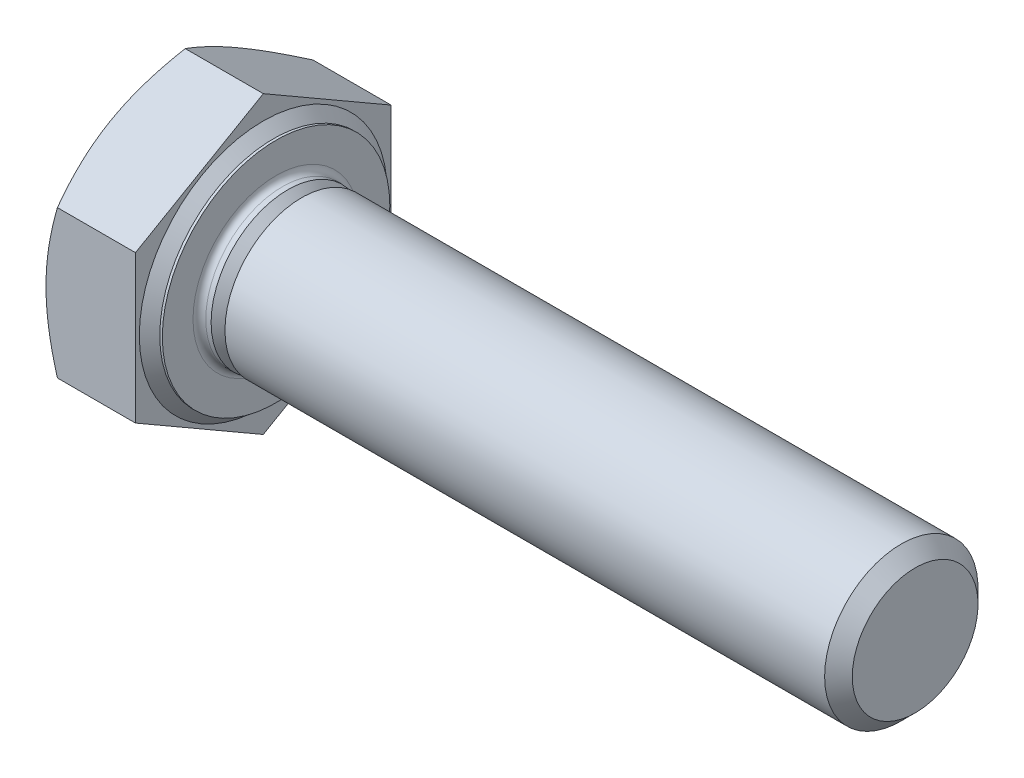
ISO-10303-21;
HEADER;
FILE_DESCRIPTION(('STEP AP214'),'2;1');
FILE_NAME('part.step','',(''),(''),'','','');
FILE_SCHEMA(('AUTOMOTIVE_DESIGN { 1 0 10303 214 1 1 1 1 }'));
ENDSEC;
DATA;
#1=APPLICATION_CONTEXT('core data for automotive mechanical design processes');
#2=APPLICATION_PROTOCOL_DEFINITION('international standard','automotive_design',2000,#1);
#3=PRODUCT_CONTEXT('',#1,'mechanical');
#4=PRODUCT('Part','Part','',(#3));
#5=PRODUCT_RELATED_PRODUCT_CATEGORY('part','',(#4));
#6=PRODUCT_DEFINITION_FORMATION('','',#4);
#7=PRODUCT_DEFINITION_CONTEXT('part definition',#1,'design');
#8=PRODUCT_DEFINITION('design','',#6,#7);
#9=PRODUCT_DEFINITION_SHAPE('','',#8);
#10=(LENGTH_UNIT() NAMED_UNIT(*) SI_UNIT(.MILLI.,.METRE.));
#11=(NAMED_UNIT(*) PLANE_ANGLE_UNIT() SI_UNIT($,.RADIAN.));
#12=(NAMED_UNIT(*) SI_UNIT($,.STERADIAN.) SOLID_ANGLE_UNIT());
#13=UNCERTAINTY_MEASURE_WITH_UNIT(LENGTH_MEASURE(1.E-05),#10,'distance_accuracy_value','');
#14=(GEOMETRIC_REPRESENTATION_CONTEXT(3) GLOBAL_UNCERTAINTY_ASSIGNED_CONTEXT((#13)) GLOBAL_UNIT_ASSIGNED_CONTEXT((#10,
#11,#12)) REPRESENTATION_CONTEXT('',''));
#15=CARTESIAN_POINT('',(0.,0.,0.));
#16=DIRECTION('',(0.,0.,1.));
#17=DIRECTION('',(1.,0.,0.));
#18=AXIS2_PLACEMENT_3D('',#15,#16,#17);
#19=CARTESIAN_POINT('',(0.,0.,0.));
#20=DIRECTION('',(-1.,0.,0.));
#21=DIRECTION('',(0.,0.,1.));
#22=AXIS2_PLACEMENT_3D('',#19,#20,#21);
#23=CYLINDRICAL_SURFACE('',#22,3.);
#24=CARTESIAN_POINT('',(0.75,0.,0.));
#25=DIRECTION('',(-1.,0.,0.));
#26=DIRECTION('',(0.,0.,1.));
#27=AXIS2_PLACEMENT_3D('',#24,#25,#26);
#28=CIRCLE('',#27,3.);
#29=CARTESIAN_POINT('',(0.75,0.,3.));
#30=VERTEX_POINT('',#29);
#31=EDGE_CURVE('E11',#30,#30,#28,.T.);
#32=ORIENTED_EDGE('',*,*,#31,.F.);
#33=EDGE_LOOP('',(#32));
#34=FACE_BOUND('',#33,.T.);
#35=CARTESIAN_POINT('',(0.95875,0.,0.));
#36=DIRECTION('',(-1.,0.,0.));
#37=DIRECTION('',(0.,0.,1.));
#38=AXIS2_PLACEMENT_3D('',#35,#36,#37);
#39=CIRCLE('',#38,3.);
#40=CARTESIAN_POINT('',(0.95875,0.,3.));
#41=VERTEX_POINT('',#40);
#42=EDGE_CURVE('E248',#41,#41,#39,.T.);
#43=ORIENTED_EDGE('',*,*,#42,.T.);
#44=EDGE_LOOP('',(#43));
#45=FACE_BOUND('',#44,.T.);
#46=ADVANCED_FACE('F16',(#34,#45),#23,.T.);
#47=CARTESIAN_POINT('',(25.5,0.,0.));
#48=DIRECTION('',(-1.,0.,0.));
#49=DIRECTION('',(0.,0.,1.));
#50=AXIS2_PLACEMENT_3D('',#47,#48,#49);
#51=PLANE('',#50);
#52=CARTESIAN_POINT('',(25.5,0.,0.));
#53=DIRECTION('',(-1.,0.,0.));
#54=DIRECTION('',(0.,0.,1.));
#55=AXIS2_PLACEMENT_3D('',#52,#53,#54);
#56=CIRCLE('',#55,2.45875);
#57=CARTESIAN_POINT('',(25.5,0.,2.45875));
#58=VERTEX_POINT('',#57);
#59=EDGE_CURVE('E128',#58,#58,#56,.T.);
#60=ORIENTED_EDGE('',*,*,#59,.F.);
#61=EDGE_LOOP('',(#60));
#62=FACE_BOUND('',#61,.T.);
#63=ADVANCED_FACE('F151',(#62),#51,.F.);
#64=CARTESIAN_POINT('',(25.5,0.,0.));
#65=DIRECTION('',(-1.,0.,0.));
#66=DIRECTION('',(0.,0.,1.));
#67=AXIS2_PLACEMENT_3D('',#64,#65,#66);
#68=CONICAL_SURFACE('',#67,2.45875,0.785398163397449);
#69=CARTESIAN_POINT('',(24.95875,0.,0.));
#70=DIRECTION('',(-1.,0.,0.));
#71=DIRECTION('',(0.,0.,1.));
#72=AXIS2_PLACEMENT_3D('',#69,#70,#71);
#73=CIRCLE('',#72,3.);
#74=CARTESIAN_POINT('',(24.95875,0.,3.));
#75=VERTEX_POINT('',#74);
#76=EDGE_CURVE('E230',#75,#75,#73,.T.);
#77=ORIENTED_EDGE('',*,*,#76,.F.);
#78=EDGE_LOOP('',(#77));
#79=FACE_BOUND('',#78,.T.);
#80=ORIENTED_EDGE('',*,*,#59,.T.);
#81=EDGE_LOOP('',(#80));
#82=FACE_BOUND('',#81,.T.);
#83=ADVANCED_FACE('F204',(#79,#82),#68,.T.);
#84=CARTESIAN_POINT('',(0.,0.,0.));
#85=DIRECTION('',(-1.,0.,0.));
#86=DIRECTION('',(0.,0.,1.));
#87=AXIS2_PLACEMENT_3D('',#84,#85,#86);
#88=CYLINDRICAL_SURFACE('',#87,3.);
#89=CARTESIAN_POINT('',(1.5,0.,0.));
#90=DIRECTION('',(-1.,0.,0.));
#91=DIRECTION('',(0.,0.,1.));
#92=AXIS2_PLACEMENT_3D('',#89,#90,#91);
#93=CIRCLE('',#92,3.);
#94=CARTESIAN_POINT('',(1.5,0.,3.));
#95=VERTEX_POINT('',#94);
#96=EDGE_CURVE('E238',#95,#95,#93,.T.);
#97=ORIENTED_EDGE('',*,*,#96,.F.);
#98=EDGE_LOOP('',(#97));
#99=FACE_BOUND('',#98,.T.);
#100=ORIENTED_EDGE('',*,*,#76,.T.);
#101=EDGE_LOOP('',(#100));
#102=FACE_BOUND('',#101,.T.);
#103=ADVANCED_FACE('F219',(#99,#102),#88,.T.);
#104=CARTESIAN_POINT('',(1.5,3.,0.));
#105=DIRECTION('',(1.,0.,0.));
#106=DIRECTION('',(0.,0.,-1.));
#107=AXIS2_PLACEMENT_3D('',#104,#105,#106);
#108=PLANE('',#107);
#109=CARTESIAN_POINT('',(1.5,0.,0.));
#110=DIRECTION('',(-1.,0.,0.));
#111=DIRECTION('',(0.,0.,1.));
#112=AXIS2_PLACEMENT_3D('',#109,#110,#111);
#113=CIRCLE('',#112,2.45875);
#114=CARTESIAN_POINT('',(1.5,0.,2.45875));
#115=VERTEX_POINT('',#114);
#116=EDGE_CURVE('E244',#115,#115,#113,.T.);
#117=ORIENTED_EDGE('',*,*,#116,.F.);
#118=EDGE_LOOP('',(#117));
#119=FACE_BOUND('',#118,.T.);
#120=ORIENTED_EDGE('',*,*,#96,.T.);
#121=EDGE_LOOP('',(#120));
#122=FACE_BOUND('',#121,.T.);
#123=ADVANCED_FACE('F215',(#119,#122),#108,.F.);
#124=CARTESIAN_POINT('',(1.5,0.,0.));
#125=DIRECTION('',(-1.,0.,0.));
#126=DIRECTION('',(0.,0.,1.));
#127=AXIS2_PLACEMENT_3D('',#124,#125,#126);
#128=CONICAL_SURFACE('',#127,2.45875,0.785398163397448);
#129=ORIENTED_EDGE('',*,*,#42,.F.);
#130=EDGE_LOOP('',(#129));
#131=FACE_BOUND('',#130,.T.);
#132=ORIENTED_EDGE('',*,*,#116,.T.);
#133=EDGE_LOOP('',(#132));
#134=FACE_BOUND('',#133,.T.);
#135=ADVANCED_FACE('F212',(#131,#134),#128,.T.);
#136=CARTESIAN_POINT('',(0.75,0.,0.));
#137=DIRECTION('',(-1.,0.,0.));
#138=DIRECTION('',(0.,0.,1.));
#139=AXIS2_PLACEMENT_3D('',#136,#137,#138);
#140=TOROIDAL_SURFACE('',#139,3.25,0.25);
#141=ORIENTED_EDGE('',*,*,#31,.T.);
#142=EDGE_LOOP('',(#141));
#143=FACE_BOUND('',#142,.T.);
#144=CARTESIAN_POINT('',(0.5,0.,0.));
#145=DIRECTION('',(-1.,0.,0.));
#146=DIRECTION('',(0.,0.,1.));
#147=AXIS2_PLACEMENT_3D('',#144,#145,#146);
#148=CIRCLE('',#147,3.25);
#149=CARTESIAN_POINT('',(0.5,0.,3.25));
#150=VERTEX_POINT('',#149);
#151=EDGE_CURVE('E252',#150,#150,#148,.T.);
#152=ORIENTED_EDGE('',*,*,#151,.F.);
#153=EDGE_LOOP('',(#152));
#154=FACE_BOUND('',#153,.T.);
#155=ADVANCED_FACE('F210',(#143,#154),#140,.F.);
#156=CARTESIAN_POINT('',(0.5,4.45,0.));
#157=DIRECTION('',(1.,0.,0.));
#158=DIRECTION('',(0.,0.,-1.));
#159=AXIS2_PLACEMENT_3D('',#156,#157,#158);
#160=PLANE('',#159);
#161=ORIENTED_EDGE('',*,*,#151,.T.);
#162=EDGE_LOOP('',(#161));
#163=FACE_BOUND('',#162,.T.);
#164=CARTESIAN_POINT('',(0.5,0.,0.));
#165=DIRECTION('',(-1.,0.,0.));
#166=DIRECTION('',(0.,0.,1.));
#167=AXIS2_PLACEMENT_3D('',#164,#165,#166);
#168=CIRCLE('',#167,4.45);
#169=CARTESIAN_POINT('',(0.5,0.,4.45));
#170=VERTEX_POINT('',#169);
#171=EDGE_CURVE('E256',#170,#170,#168,.T.);
#172=ORIENTED_EDGE('',*,*,#171,.F.);
#173=EDGE_LOOP('',(#172));
#174=FACE_BOUND('',#173,.T.);
#175=ADVANCED_FACE('F286',(#163,#174),#160,.T.);
#176=CARTESIAN_POINT('',(-0.4,0.,0.));
#177=DIRECTION('',(-1.,0.,0.));
#178=DIRECTION('',(0.,0.,1.));
#179=AXIS2_PLACEMENT_3D('',#176,#177,#178);
#180=CYLINDRICAL_SURFACE('',#179,4.45);
#181=ORIENTED_EDGE('',*,*,#171,.T.);
#182=EDGE_LOOP('',(#181));
#183=FACE_BOUND('',#182,.T.);
#184=CARTESIAN_POINT('',(0.4,0.,0.));
#185=DIRECTION('',(-1.,0.,0.));
#186=DIRECTION('',(0.,0.,1.));
#187=AXIS2_PLACEMENT_3D('',#184,#185,#186);
#188=CIRCLE('',#187,4.45);
#189=CARTESIAN_POINT('',(0.4,0.,4.45));
#190=VERTEX_POINT('',#189);
#191=EDGE_CURVE('E260',#190,#190,#188,.T.);
#192=ORIENTED_EDGE('',*,*,#191,.F.);
#193=EDGE_LOOP('',(#192));
#194=FACE_BOUND('',#193,.T.);
#195=ADVANCED_FACE('F277',(#183,#194),#180,.T.);
#196=CARTESIAN_POINT('',(0.,0.,0.));
#197=DIRECTION('',(-1.,0.,0.));
#198=DIRECTION('',(0.,0.,1.));
#199=AXIS2_PLACEMENT_3D('',#196,#197,#198);
#200=CONICAL_SURFACE('',#199,4.85,0.785398163397449);
#201=ORIENTED_EDGE('',*,*,#191,.T.);
#202=EDGE_LOOP('',(#201));
#203=FACE_BOUND('',#202,.T.);
#204=CARTESIAN_POINT('',(0.,0.,0.));
#205=DIRECTION('',(-1.,0.,0.));
#206=DIRECTION('',(0.,0.,1.));
#207=AXIS2_PLACEMENT_3D('',#204,#205,#206);
#208=CIRCLE('',#207,4.85);
#209=CARTESIAN_POINT('',(0.,0.,4.85));
#210=VERTEX_POINT('',#209);
#211=EDGE_CURVE('E264',#210,#210,#208,.T.);
#212=ORIENTED_EDGE('',*,*,#211,.F.);
#213=EDGE_LOOP('',(#212));
#214=FACE_BOUND('',#213,.T.);
#215=ADVANCED_FACE('F274',(#203,#214),#200,.T.);
#216=CARTESIAN_POINT('',(-3.5,5.77350269189626,0.));
#217=DIRECTION('',(-1.,0.,0.));
#218=DIRECTION('',(0.,0.,1.));
#219=AXIS2_PLACEMENT_3D('',#216,#217,#218);
#220=PLANE('',#219);
#221=CARTESIAN_POINT('',(-3.5,0.,0.));
#222=DIRECTION('',(-1.,0.,0.));
#223=DIRECTION('',(0.,0.,1.));
#224=AXIS2_PLACEMENT_3D('',#221,#222,#223);
#225=CIRCLE('',#224,5.);
#226=CARTESIAN_POINT('',(-3.5,-4.3301270189222,2.5));
#227=VERTEX_POINT('',#226);
#228=CARTESIAN_POINT('',(-3.5,0.,5.));
#229=VERTEX_POINT('',#228);
#230=EDGE_CURVE('E533',#227,#229,#225,.T.);
#231=ORIENTED_EDGE('',*,*,#230,.T.);
#232=CARTESIAN_POINT('',(-3.5,4.33012701892219,2.5));
#233=VERTEX_POINT('',#232);
#234=EDGE_CURVE('E26',#229,#233,#225,.T.);
#235=ORIENTED_EDGE('',*,*,#234,.T.);
#236=CARTESIAN_POINT('',(-3.5,4.3301270189222,-2.5));
#237=VERTEX_POINT('',#236);
#238=EDGE_CURVE('E541',#233,#237,#225,.T.);
#239=ORIENTED_EDGE('',*,*,#238,.T.);
#240=CARTESIAN_POINT('',(-3.5,0.,0.));
#241=DIRECTION('',(1.,0.,0.));
#242=DIRECTION('',(0.,0.,-1.));
#243=AXIS2_PLACEMENT_3D('',#240,#241,#242);
#244=CIRCLE('',#243,5.);
#245=CARTESIAN_POINT('',(-3.5,0.,-5.));
#246=VERTEX_POINT('',#245);
#247=EDGE_CURVE('E119',#246,#237,#244,.T.);
#248=ORIENTED_EDGE('',*,*,#247,.F.);
#249=CARTESIAN_POINT('',(-3.5,-4.3301270189222,-2.5));
#250=VERTEX_POINT('',#249);
#251=EDGE_CURVE('E540',#246,#250,#225,.T.);
#252=ORIENTED_EDGE('',*,*,#251,.T.);
#253=EDGE_CURVE('E535',#250,#227,#225,.T.);
#254=ORIENTED_EDGE('',*,*,#253,.T.);
#255=EDGE_LOOP('',(#231,#235,#239,#248,#252,#254));
#256=FACE_BOUND('',#255,.T.);
#257=ADVANCED_FACE('F276',(#256),#220,.T.);
#258=CARTESIAN_POINT('',(-3.05255354137804,0.,0.));
#259=DIRECTION('',(1.,0.,0.));
#260=DIRECTION('',(0.,0.,-1.));
#261=AXIS2_PLACEMENT_3D('',#258,#259,#260);
#262=CONICAL_SURFACE('',#261,5.775,1.0471975511966);
#263=ORIENTED_EDGE('',*,*,#247,.T.);
#264=CARTESIAN_POINT('',(-3.05341734594793,5.7735038465968,2.00000000044876E-06));
#265=CARTESIAN_POINT('',(-3.12667401283849,5.64664194849674,-0.219729253053924));
#266=CARTESIAN_POINT('',(-3.19330350087609,5.51869499330503,-0.441339880119702));
#267=CARTESIAN_POINT('',(-3.30960388176341,5.26058573190113,-0.888398234775334));
#268=CARTESIAN_POINT('',(-3.35923363803499,5.13041884098811,-1.11385390329997));
#269=CARTESIAN_POINT('',(-3.43647343389727,4.87167833614423,-1.56200560366558));
#270=CARTESIAN_POINT('',(-3.46459799992946,4.74314500903636,-1.78463185668228));
#271=CARTESIAN_POINT('',(-3.48981464288413,4.54989306416545,-2.1193540438602));
#272=CARTESIAN_POINT('',(-3.49539321968896,4.48543168714627,-2.23100442398327));
#273=CARTESIAN_POINT('',(-3.50079886451652,4.35644942308917,-2.45440825860543));
#274=CARTESIAN_POINT('',(-3.50062611028572,4.291928537952,-2.56616170981234));
#275=CARTESIAN_POINT('',(-3.49223835401768,4.11517425168036,-2.87230911409038));
#276=CARTESIAN_POINT('',(-3.47816111429647,4.00299946429516,-3.06660154516979));
#277=CARTESIAN_POINT('',(-3.43352860367382,3.77939435471464,-3.45389695579525));
#278=CARTESIAN_POINT('',(-3.40295808665975,3.66796481805389,-3.64689857475553));
#279=CARTESIAN_POINT('',(-3.326542206783,3.44390947117283,-4.03497381926099));
#280=CARTESIAN_POINT('',(-3.28037315312652,3.33131192785644,-4.22999848509243));
#281=CARTESIAN_POINT('',(-3.17558875648398,3.10779574582578,-4.61713986868334));
#282=CARTESIAN_POINT('',(-3.11699801824105,2.99687424581388,-4.8092615423557));
#283=CARTESIAN_POINT('',(-3.05341734594793,2.88675019124759,-5.000002));
#284=B_SPLINE_CURVE_WITH_KNOTS('',3,(#264,#265,#266,#267,#268,#269,#270,#271,#272,#273,#274,
#275,#276,#277,#278,#279,#280,#281,#282,#283),.UNSPECIFIED.,.F.,.F.,(4,2,2,2,2,2,2,2,2,4),(0.,
0.792540187012439,1.58698486313849,2.36176947896395,2.74878786986339,3.13579429986343,
3.80946255620209,4.48375460996337,5.17299926182492,5.86089121185927),.UNSPECIFIED.);
#285=CARTESIAN_POINT('',(-3.0534180126148,2.88675134594813,-5.));
#286=VERTEX_POINT('',#285);
#287=EDGE_CURVE('E169',#237,#286,#284,.T.);
#288=ORIENTED_EDGE('',*,*,#287,.T.);
#289=CARTESIAN_POINT('',(-1.10730851220314,-7.6562098916072,-5.));
#290=CARTESIAN_POINT('',(-1.21339764971142,-7.43668068445188,-5.));
#291=CARTESIAN_POINT('',(-1.31843220971194,-7.21663244981121,-5.));
#292=CARTESIAN_POINT('',(-1.52578955660455,-6.77521729214901,-5.));
#293=CARTESIAN_POINT('',(-1.62811187401152,-6.55385014884432,-5.));
#294=CARTESIAN_POINT('',(-1.82998113103873,-6.10832079221155,-5.));
#295=CARTESIAN_POINT('',(-1.92950883856025,-5.8841498332562,-5.));
#296=CARTESIAN_POINT('',(-2.12428946678928,-5.43396545890423,-5.));
#297=CARTESIAN_POINT('',(-2.21954261031161,-5.20795214026934,-5.));
#298=CARTESIAN_POINT('',(-2.40576853562678,-4.75091730358843,-5.));
#299=CARTESIAN_POINT('',(-2.49667439468201,-4.51986836696229,-5.));
#300=CARTESIAN_POINT('',(-2.67136663535019,-4.05504511794165,-5.));
#301=CARTESIAN_POINT('',(-2.75515222488515,-3.82127050561654,-5.));
#302=CARTESIAN_POINT('',(-2.91335295122634,-3.3511049214154,-5.));
#303=CARTESIAN_POINT('',(-2.98778800852407,-3.1147207202618,-5.));
#304=CARTESIAN_POINT('',(-3.12486947210752,-2.63858935414023,-5.));
#305=CARTESIAN_POINT('',(-3.1875196062624,-2.39884327849117,-5.));
#306=CARTESIAN_POINT('',(-3.29799301517174,-1.91583600979795,-5.));
#307=CARTESIAN_POINT('',(-3.345812348464,-1.67257390027251,-5.));
#308=CARTESIAN_POINT('',(-3.42339260894803,-1.18308256945893,-5.));
#309=CARTESIAN_POINT('',(-3.45315352030607,-0.936853345569397,-5.));
#310=CARTESIAN_POINT('',(-3.48234325133118,-0.567117593289448,-5.));
#311=CARTESIAN_POINT('',(-3.48949936634909,-0.444189898759252,-5.));
#312=CARTESIAN_POINT('',(-3.49860265589306,-0.198136128994919,-5.));
#313=CARTESIAN_POINT('',(-3.50054989807679,-0.0750100563582863,-5.));
#314=CARTESIAN_POINT('',(-3.49918313774808,0.171177216207568,-5.));
#315=CARTESIAN_POINT('',(-3.49587061329656,0.294238424644022,-5.));
#316=CARTESIAN_POINT('',(-3.48406827403109,0.540114422491313,-5.));
#317=CARTESIAN_POINT('',(-3.47557819794883,0.662929199152971,-5.));
#318=CARTESIAN_POINT('',(-3.44890221291608,0.960602635172519,-5.));
#319=CARTESIAN_POINT('',(-3.42812146624754,1.13523252606317,-5.));
#320=CARTESIAN_POINT('',(-3.37724859224778,1.48312982453558,-5.));
#321=CARTESIAN_POINT('',(-3.34715522336811,1.65639704728773,-5.));
#322=CARTESIAN_POINT('',(-3.27872143768563,2.0014599099285,-5.));
#323=CARTESIAN_POINT('',(-3.24037278751756,2.17325390132186,-5.));
#324=CARTESIAN_POINT('',(-3.15659803659306,2.51508012917844,-5.));
#325=CARTESIAN_POINT('',(-3.11117236671524,2.68511247222647,-5.));
#326=CARTESIAN_POINT('',(-3.01314465542335,3.02759472997325,-5.));
#327=CARTESIAN_POINT('',(-2.96039407843569,3.20000183568428,-5.));
#328=CARTESIAN_POINT('',(-2.84968060702553,3.54299370259063,-5.));
#329=CARTESIAN_POINT('',(-2.79172130765132,3.71357963115188,-5.));
#330=CARTESIAN_POINT('',(-2.6717876190005,4.0522446464634,-5.));
#331=CARTESIAN_POINT('',(-2.60983766516145,4.22033243885282,-5.));
#332=CARTESIAN_POINT('',(-2.48230148307792,4.55520387372807,-5.));
#333=CARTESIAN_POINT('',(-2.41671378527652,4.72198695763952,-5.));
#334=CARTESIAN_POINT('',(-2.34966706307693,4.88816412582648,-5.));
#335=B_SPLINE_CURVE_WITH_KNOTS('',3,(#289,#290,#291,#292,#293,#294,#295,#296,#297,#298,#299,
#300,#301,#302,#303,#304,#305,#306,#307,#308,#309,#310,#311,#312,#313,#314,#315,#316,#317,#318,
#319,#320,#321,#322,#323,#324,#325,#326,#327,#328,#329,#330,#331,#332,#333,#334),.UNSPECIFIED.,
.F.,.F.,(4,2,2,2,2,2,2,2,2,2,2,2,2,2,2,2,2,2,2,2,2,2,4),(0.,0.731468501053907,1.46306280212577,
2.19884351250474,2.9345858251137,3.67936259473396,4.42422210717283,5.16746683356837,
5.9104760560418,6.65368257320435,7.39688974201329,7.76620341787992,8.13551229673491,
8.5047174134909,8.87394116252395,9.40123334160667,9.92859584900567,10.456486776027,
10.9843455753877,11.5251349139371,12.0655538262241,12.6029309498223,13.1405267642076),.UNSPECIFIED.);
#336=EDGE_CURVE('E176',#286,#246,#335,.F.);
#337=ORIENTED_EDGE('',*,*,#336,.T.);
#338=EDGE_LOOP('',(#263,#288,#337));
#339=FACE_BOUND('',#338,.T.);
#340=ADVANCED_FACE('F284',(#339),#262,.T.);
#341=ORIENTED_EDGE('',*,*,#251,.F.);
#342=CARTESIAN_POINT('',(-3.0534180126148,-2.88675134594813,-5.));
#343=VERTEX_POINT('',#342);
#344=EDGE_CURVE('E41',#246,#343,#335,.F.);
#345=ORIENTED_EDGE('',*,*,#344,.T.);
#346=CARTESIAN_POINT('',(-3.05341734594793,-2.88675019124759,-5.000002));
#347=CARTESIAN_POINT('',(-3.12667401283849,-3.01361208934765,-4.78027074694608));
#348=CARTESIAN_POINT('',(-3.19330350087609,-3.14155904453936,-4.5586601198803));
#349=CARTESIAN_POINT('',(-3.30960388176341,-3.39966830594326,-4.11160176522467));
#350=CARTESIAN_POINT('',(-3.359233638035,-3.52983519685628,-3.88614609670003));
#351=CARTESIAN_POINT('',(-3.43647343389728,-3.78857570170016,-3.43799439633442));
#352=CARTESIAN_POINT('',(-3.46459799992946,-3.91710902880803,-3.21536814331772));
#353=CARTESIAN_POINT('',(-3.48981464288414,-4.11036097367894,-2.8806459561398));
#354=CARTESIAN_POINT('',(-3.49539321968897,-4.17482235069812,-2.76899557601673));
#355=CARTESIAN_POINT('',(-3.50079886451652,-4.30380461475522,-2.54559174139457));
#356=CARTESIAN_POINT('',(-3.50062611028572,-4.36832549989239,-2.43383829018766));
#357=CARTESIAN_POINT('',(-3.49223835401768,-4.54507978616403,-2.12769088590962));
#358=CARTESIAN_POINT('',(-3.47816111429647,-4.65725457354923,-1.93339845483021));
#359=CARTESIAN_POINT('',(-3.43352860367382,-4.88085968312975,-1.54610304420475));
#360=CARTESIAN_POINT('',(-3.40295808665975,-4.9922892197905,-1.35310142524446));
#361=CARTESIAN_POINT('',(-3.326542206783,-5.21634456667156,-0.965026180739006));
#362=CARTESIAN_POINT('',(-3.28037315312652,-5.32894210998795,-0.770001514907569));
#363=CARTESIAN_POINT('',(-3.17558875648398,-5.55245829201861,-0.382860131316661));
#364=CARTESIAN_POINT('',(-3.11699801824105,-5.66337979203051,-0.190738457644302));
#365=CARTESIAN_POINT('',(-3.05341734594793,-5.7735038465968,1.99999999751809E-06));
#366=B_SPLINE_CURVE_WITH_KNOTS('',3,(#346,#347,#348,#349,#350,#351,#352,#353,#354,#355,#356,
#357,#358,#359,#360,#361,#362,#363,#364,#365),.UNSPECIFIED.,.F.,.F.,(4,2,2,2,2,2,2,2,2,4),(0.,
0.792540187012439,1.58698486313849,2.36176947896395,2.74878786986339,3.13579429986343,
3.80946255620209,4.48375460996337,5.17299926182492,5.86089121185927),.UNSPECIFIED.);
#367=EDGE_CURVE('E552',#343,#250,#366,.T.);
#368=ORIENTED_EDGE('',*,*,#367,.T.);
#369=EDGE_LOOP('',(#341,#345,#368));
#370=FACE_BOUND('',#369,.T.);
#371=ADVANCED_FACE('F398',(#370),#262,.T.);
#372=ORIENTED_EDGE('',*,*,#253,.F.);
#373=CARTESIAN_POINT('',(-3.0534180126148,-5.77350269189626,0.));
#374=VERTEX_POINT('',#373);
#375=EDGE_CURVE('E33',#250,#374,#366,.T.);
#376=ORIENTED_EDGE('',*,*,#375,.T.);
#377=CARTESIAN_POINT('',(-3.05341734594793,-5.7735038465968,-2.00000000196343E-06));
#378=CARTESIAN_POINT('',(-3.12667401283849,-5.64664194849674,0.219729253053923));
#379=CARTESIAN_POINT('',(-3.19330350087609,-5.51869499330503,0.441339880119701));
#380=CARTESIAN_POINT('',(-3.30960388176341,-5.26058573190113,0.888398234775333));
#381=CARTESIAN_POINT('',(-3.35923363803499,-5.13041884098811,1.11385390329997));
#382=CARTESIAN_POINT('',(-3.43647343389728,-4.87167833614423,1.56200560366558));
#383=CARTESIAN_POINT('',(-3.46459799992946,-4.74314500903636,1.78463185668228));
#384=CARTESIAN_POINT('',(-3.48981464288413,-4.54989306416545,2.1193540438602));
#385=CARTESIAN_POINT('',(-3.49539321968897,-4.48543168714627,2.23100442398327));
#386=CARTESIAN_POINT('',(-3.50079886451652,-4.35644942308917,2.45440825860543));
#387=CARTESIAN_POINT('',(-3.50062611028572,-4.291928537952,2.56616170981234));
#388=CARTESIAN_POINT('',(-3.49223835401768,-4.11517425168036,2.87230911409038));
#389=CARTESIAN_POINT('',(-3.47816111429647,-4.00299946429516,3.06660154516979));
#390=CARTESIAN_POINT('',(-3.43352860367382,-3.77939435471464,3.45389695579525));
#391=CARTESIAN_POINT('',(-3.40295808665975,-3.66796481805389,3.64689857475554));
#392=CARTESIAN_POINT('',(-3.326542206783,-3.44390947117283,4.03497381926099));
#393=CARTESIAN_POINT('',(-3.28037315312652,-3.33131192785644,4.22999848509243));
#394=CARTESIAN_POINT('',(-3.17558875648398,-3.10779574582578,4.61713986868334));
#395=CARTESIAN_POINT('',(-3.11699801824105,-2.99687424581388,4.8092615423557));
#396=CARTESIAN_POINT('',(-3.05341734594793,-2.88675019124759,5.000002));
#397=B_SPLINE_CURVE_WITH_KNOTS('',3,(#377,#378,#379,#380,#381,#382,#383,#384,#385,#386,#387,
#388,#389,#390,#391,#392,#393,#394,#395,#396),.UNSPECIFIED.,.F.,.F.,(4,2,2,2,2,2,2,2,2,4),(0.,
0.792540187012439,1.58698486313849,2.36176947896395,2.7487878698634,3.13579429986343,
3.80946255620209,4.48375460996337,5.17299926182492,5.86089121185927),.UNSPECIFIED.);
#398=EDGE_CURVE('E554',#374,#227,#397,.T.);
#399=ORIENTED_EDGE('',*,*,#398,.T.);
#400=EDGE_LOOP('',(#372,#376,#399));
#401=FACE_BOUND('',#400,.T.);
#402=ADVANCED_FACE('F409',(#401),#262,.T.);
#403=ORIENTED_EDGE('',*,*,#230,.F.);
#404=CARTESIAN_POINT('',(-3.0534180126148,-2.88675134594813,5.));
#405=VERTEX_POINT('',#404);
#406=EDGE_CURVE('E125',#227,#405,#397,.T.);
#407=ORIENTED_EDGE('',*,*,#406,.T.);
#408=CARTESIAN_POINT('',(-1.10730851220314,-7.6562098916072,5.));
#409=CARTESIAN_POINT('',(-1.21339764971142,-7.43668068445188,5.));
#410=CARTESIAN_POINT('',(-1.31843220971194,-7.21663244981121,5.));
#411=CARTESIAN_POINT('',(-1.52578955660455,-6.77521729214901,5.));
#412=CARTESIAN_POINT('',(-1.62811187401153,-6.55385014884432,5.));
#413=CARTESIAN_POINT('',(-1.82998113103873,-6.10832079221155,5.));
#414=CARTESIAN_POINT('',(-1.92950883856025,-5.8841498332562,5.));
#415=CARTESIAN_POINT('',(-2.12428946678928,-5.43396545890423,5.));
#416=CARTESIAN_POINT('',(-2.21954261031161,-5.20795214026934,5.));
#417=CARTESIAN_POINT('',(-2.40576853562678,-4.75091730358843,5.));
#418=CARTESIAN_POINT('',(-2.49667439468201,-4.51986836696229,5.));
#419=CARTESIAN_POINT('',(-2.67136663535019,-4.05504511794165,5.));
#420=CARTESIAN_POINT('',(-2.75515222488515,-3.82127050561655,5.));
#421=CARTESIAN_POINT('',(-2.91335295122634,-3.3511049214154,5.));
#422=CARTESIAN_POINT('',(-2.98778800852407,-3.1147207202618,5.));
#423=CARTESIAN_POINT('',(-3.12486947210752,-2.63858935414024,5.));
#424=CARTESIAN_POINT('',(-3.1875196062624,-2.39884327849118,5.));
#425=CARTESIAN_POINT('',(-3.29799301517174,-1.91583600979795,5.));
#426=CARTESIAN_POINT('',(-3.345812348464,-1.67257390027251,5.));
#427=CARTESIAN_POINT('',(-3.42339260894802,-1.18308256945893,5.));
#428=CARTESIAN_POINT('',(-3.45315352030607,-0.936853345569402,5.));
#429=CARTESIAN_POINT('',(-3.48234325133118,-0.567117593289452,5.));
#430=CARTESIAN_POINT('',(-3.48949936634909,-0.444189898759257,5.));
#431=CARTESIAN_POINT('',(-3.49860265589306,-0.198136128994923,5.));
#432=CARTESIAN_POINT('',(-3.50054989807679,-0.0750100563582906,5.));
#433=CARTESIAN_POINT('',(-3.49918313774808,0.171177216207563,5.));
#434=CARTESIAN_POINT('',(-3.49587061329656,0.294238424644018,5.));
#435=CARTESIAN_POINT('',(-3.48406827403109,0.540114422491308,5.));
#436=CARTESIAN_POINT('',(-3.47557819794883,0.662929199152967,5.));
#437=CARTESIAN_POINT('',(-3.44890221291608,0.960602635172515,5.));
#438=CARTESIAN_POINT('',(-3.42812146624754,1.13523252606317,5.));
#439=CARTESIAN_POINT('',(-3.37724859224778,1.48312982453558,5.));
#440=CARTESIAN_POINT('',(-3.34715522336811,1.65639704728773,5.));
#441=CARTESIAN_POINT('',(-3.27872143768562,2.0014599099285,5.));
#442=CARTESIAN_POINT('',(-3.24037278751756,2.17325390132186,5.));
#443=CARTESIAN_POINT('',(-3.15659803659306,2.51508012917844,5.));
#444=CARTESIAN_POINT('',(-3.11117236671524,2.68511247222647,5.));
#445=CARTESIAN_POINT('',(-3.01314465542335,3.02759472997325,5.));
#446=CARTESIAN_POINT('',(-2.96039407843568,3.20000183568427,5.));
#447=CARTESIAN_POINT('',(-2.84968060702553,3.54299370259062,5.));
#448=CARTESIAN_POINT('',(-2.79172130765132,3.71357963115188,5.));
#449=CARTESIAN_POINT('',(-2.67178761900049,4.0522446464634,5.));
#450=CARTESIAN_POINT('',(-2.60983766516145,4.22033243885281,5.00000000000001));
#451=CARTESIAN_POINT('',(-2.48230148307792,4.55520387372807,5.00000000000001));
#452=CARTESIAN_POINT('',(-2.41671378527652,4.72198695763951,5.));
#453=CARTESIAN_POINT('',(-2.34966706307693,4.88816412582648,5.));
#454=B_SPLINE_CURVE_WITH_KNOTS('',3,(#408,#409,#410,#411,#412,#413,#414,#415,#416,#417,#418,
#419,#420,#421,#422,#423,#424,#425,#426,#427,#428,#429,#430,#431,#432,#433,#434,#435,#436,#437,
#438,#439,#440,#441,#442,#443,#444,#445,#446,#447,#448,#449,#450,#451,#452,#453),.UNSPECIFIED.,
.F.,.F.,(4,2,2,2,2,2,2,2,2,2,2,2,2,2,2,2,2,2,2,2,2,2,4),(0.,0.731468501053906,1.46306280212577,
2.19884351250474,2.9345858251137,3.67936259473396,4.42422210717282,5.16746683356836,
5.91047605604179,6.65368257320434,7.39688974201329,7.76620341787991,8.13551229673491,
8.5047174134909,8.87394116252395,9.40123334160666,9.92859584900567,10.456486776027,
10.9843455753877,11.5251349139371,12.0655538262241,12.6029309498223,13.1405267642076),.UNSPECIFIED.);
#455=EDGE_CURVE('E118',#405,#229,#454,.T.);
#456=ORIENTED_EDGE('',*,*,#455,.T.);
#457=EDGE_LOOP('',(#403,#407,#456));
#458=FACE_BOUND('',#457,.T.);
#459=ADVANCED_FACE('F150',(#458),#262,.T.);
#460=ORIENTED_EDGE('',*,*,#238,.F.);
#461=CARTESIAN_POINT('',(-3.05341734594793,2.88675019124759,5.000002));
#462=CARTESIAN_POINT('',(-3.12667401283849,3.01361208934764,4.78027074694607));
#463=CARTESIAN_POINT('',(-3.19330350087609,3.14155904453935,4.5586601198803));
#464=CARTESIAN_POINT('',(-3.30960388176341,3.39966830594325,4.11160176522467));
#465=CARTESIAN_POINT('',(-3.359233638035,3.52983519685628,3.88614609670003));
#466=CARTESIAN_POINT('',(-3.43647343389728,3.78857570170015,3.43799439633442));
#467=CARTESIAN_POINT('',(-3.46459799992946,3.91710902880802,3.21536814331772));
#468=CARTESIAN_POINT('',(-3.48981464288414,4.11036097367893,2.8806459561398));
#469=CARTESIAN_POINT('',(-3.49539321968897,4.17482235069811,2.76899557601673));
#470=CARTESIAN_POINT('',(-3.50079886451652,4.30380461475521,2.54559174139457));
#471=CARTESIAN_POINT('',(-3.50062611028573,4.36832549989239,2.43383829018766));
#472=CARTESIAN_POINT('',(-3.49223835401768,4.54507978616402,2.12769088590962));
#473=CARTESIAN_POINT('',(-3.47816111429648,4.65725457354923,1.93339845483021));
#474=CARTESIAN_POINT('',(-3.43352860367382,4.88085968312974,1.54610304420475));
#475=CARTESIAN_POINT('',(-3.40295808665975,4.9922892197905,1.35310142524446));
#476=CARTESIAN_POINT('',(-3.326542206783,5.21634456667155,0.965026180739006));
#477=CARTESIAN_POINT('',(-3.28037315312653,5.32894210998795,0.770001514907569));
#478=CARTESIAN_POINT('',(-3.17558875648398,5.55245829201861,0.382860131316659));
#479=CARTESIAN_POINT('',(-3.11699801824105,5.66337979203051,0.1907384576443));
#480=CARTESIAN_POINT('',(-3.05341734594793,5.7735038465968,-1.99999999976906E-06));
#481=B_SPLINE_CURVE_WITH_KNOTS('',3,(#461,#462,#463,#464,#465,#466,#467,#468,#469,#470,#471,
#472,#473,#474,#475,#476,#477,#478,#479,#480),.UNSPECIFIED.,.F.,.F.,(4,2,2,2,2,2,2,2,2,4),(0.,
0.79254018701244,1.58698486313849,2.36176947896395,2.74878786986339,3.13579429986343,
3.80946255620209,4.48375460996337,5.17299926182492,5.86089121185928),.UNSPECIFIED.);
#482=CARTESIAN_POINT('',(-3.0534180126148,5.77350269189626,0.));
#483=VERTEX_POINT('',#482);
#484=EDGE_CURVE('E108',#233,#483,#481,.T.);
#485=ORIENTED_EDGE('',*,*,#484,.T.);
#486=EDGE_CURVE('E175',#483,#237,#284,.T.);
#487=ORIENTED_EDGE('',*,*,#486,.T.);
#488=EDGE_LOOP('',(#460,#485,#487));
#489=FACE_BOUND('',#488,.T.);
#490=ADVANCED_FACE('F149',(#489),#262,.T.);
#491=CARTESIAN_POINT('',(-3.0534180126148,2.88675134594812,5.));
#492=VERTEX_POINT('',#491);
#493=EDGE_CURVE('E94',#229,#492,#454,.T.);
#494=ORIENTED_EDGE('',*,*,#493,.T.);
#495=EDGE_CURVE('E105',#492,#233,#481,.T.);
#496=ORIENTED_EDGE('',*,*,#495,.T.);
#497=ORIENTED_EDGE('',*,*,#234,.F.);
#498=EDGE_LOOP('',(#494,#496,#497));
#499=FACE_BOUND('',#498,.T.);
#500=ADVANCED_FACE('F114',(#499),#262,.T.);
#501=CARTESIAN_POINT('',(-3.5,5.77350269189626,0.));
#502=DIRECTION('',(0.,-0.866025403784439,0.5));
#503=DIRECTION('',(0.,0.5,0.866025403784439));
#504=AXIS2_PLACEMENT_3D('',#501,#502,#503);
#505=PLANE('',#504);
#506=ORIENTED_EDGE('',*,*,#486,.F.);
#507=DIRECTION('',(1.,0.,0.));
#508=VECTOR('',#507,1.);
#509=CARTESIAN_POINT('',(-3.5,5.77350269189626,0.));
#510=LINE('',#509,#508);
#511=CARTESIAN_POINT('',(0.,5.77350269189626,0.));
#512=VERTEX_POINT('',#511);
#513=EDGE_CURVE('E532',#483,#512,#510,.T.);
#514=ORIENTED_EDGE('',*,*,#513,.T.);
#515=DIRECTION('',(0.,-0.5,-0.866025403784439));
#516=VECTOR('',#515,1.);
#517=CARTESIAN_POINT('',(0.,5.77350269189626,0.));
#518=LINE('',#517,#516);
#519=CARTESIAN_POINT('',(0.,2.88675134594813,-5.));
#520=VERTEX_POINT('',#519);
#521=EDGE_CURVE('E517',#512,#520,#518,.T.);
#522=ORIENTED_EDGE('',*,*,#521,.T.);
#523=DIRECTION('',(1.,0.,0.));
#524=VECTOR('',#523,1.);
#525=CARTESIAN_POINT('',(-3.5,2.88675134594813,-5.));
#526=LINE('',#525,#524);
#527=EDGE_CURVE('E530',#286,#520,#526,.T.);
#528=ORIENTED_EDGE('',*,*,#527,.F.);
#529=ORIENTED_EDGE('',*,*,#287,.F.);
#530=EDGE_LOOP('',(#506,#514,#522,#528,#529));
#531=FACE_BOUND('',#530,.T.);
#532=ADVANCED_FACE('F148',(#531),#505,.F.);
#533=CARTESIAN_POINT('',(-3.5,2.88675134594813,-5.));
#534=DIRECTION('',(0.,0.,1.));
#535=DIRECTION('',(0.,1.,0.));
#536=AXIS2_PLACEMENT_3D('',#533,#534,#535);
#537=PLANE('',#536);
#538=ORIENTED_EDGE('',*,*,#336,.F.);
#539=ORIENTED_EDGE('',*,*,#527,.T.);
#540=DIRECTION('',(0.,-1.,0.));
#541=VECTOR('',#540,1.);
#542=CARTESIAN_POINT('',(0.,2.88675134594813,-5.));
#543=LINE('',#542,#541);
#544=CARTESIAN_POINT('',(0.,-2.88675134594813,-5.));
#545=VERTEX_POINT('',#544);
#546=EDGE_CURVE('E521',#520,#545,#543,.T.);
#547=ORIENTED_EDGE('',*,*,#546,.T.);
#548=DIRECTION('',(1.,0.,0.));
#549=VECTOR('',#548,1.);
#550=CARTESIAN_POINT('',(-3.5,-2.88675134594813,-5.));
#551=LINE('',#550,#549);
#552=EDGE_CURVE('E528',#343,#545,#551,.T.);
#553=ORIENTED_EDGE('',*,*,#552,.F.);
#554=ORIENTED_EDGE('',*,*,#344,.F.);
#555=EDGE_LOOP('',(#538,#539,#547,#553,#554));
#556=FACE_BOUND('',#555,.T.);
#557=ADVANCED_FACE('F183',(#556),#537,.F.);
#558=CARTESIAN_POINT('',(-3.5,-2.88675134594813,-5.));
#559=DIRECTION('',(0.,0.866025403784439,0.5));
#560=DIRECTION('',(0.,0.5,-0.866025403784439));
#561=AXIS2_PLACEMENT_3D('',#558,#559,#560);
#562=PLANE('',#561);
#563=ORIENTED_EDGE('',*,*,#367,.F.);
#564=ORIENTED_EDGE('',*,*,#552,.T.);
#565=DIRECTION('',(0.,-0.5,0.866025403784439));
#566=VECTOR('',#565,1.);
#567=CARTESIAN_POINT('',(0.,-2.88675134594813,-5.));
#568=LINE('',#567,#566);
#569=CARTESIAN_POINT('',(0.,-5.77350269189626,0.));
#570=VERTEX_POINT('',#569);
#571=EDGE_CURVE('E562',#545,#570,#568,.T.);
#572=ORIENTED_EDGE('',*,*,#571,.T.);
#573=DIRECTION('',(1.,0.,0.));
#574=VECTOR('',#573,1.);
#575=CARTESIAN_POINT('',(-3.5,-5.77350269189626,0.));
#576=LINE('',#575,#574);
#577=EDGE_CURVE('E526',#374,#570,#576,.T.);
#578=ORIENTED_EDGE('',*,*,#577,.F.);
#579=ORIENTED_EDGE('',*,*,#375,.F.);
#580=EDGE_LOOP('',(#563,#564,#572,#578,#579));
#581=FACE_BOUND('',#580,.T.);
#582=ADVANCED_FACE('F187',(#581),#562,.F.);
#583=CARTESIAN_POINT('',(-3.5,-5.77350269189626,0.));
#584=DIRECTION('',(0.,0.866025403784439,-0.5));
#585=DIRECTION('',(0.,-0.5,-0.866025403784439));
#586=AXIS2_PLACEMENT_3D('',#583,#584,#585);
#587=PLANE('',#586);
#588=ORIENTED_EDGE('',*,*,#398,.F.);
#589=ORIENTED_EDGE('',*,*,#577,.T.);
#590=DIRECTION('',(0.,0.5,0.866025403784439));
#591=VECTOR('',#590,1.);
#592=CARTESIAN_POINT('',(0.,-5.77350269189626,0.));
#593=LINE('',#592,#591);
#594=CARTESIAN_POINT('',(0.,-2.88675134594813,5.));
#595=VERTEX_POINT('',#594);
#596=EDGE_CURVE('E559',#570,#595,#593,.T.);
#597=ORIENTED_EDGE('',*,*,#596,.T.);
#598=DIRECTION('',(1.,0.,0.));
#599=VECTOR('',#598,1.);
#600=CARTESIAN_POINT('',(-3.5,-2.88675134594813,5.));
#601=LINE('',#600,#599);
#602=EDGE_CURVE('E102',#405,#595,#601,.T.);
#603=ORIENTED_EDGE('',*,*,#602,.F.);
#604=ORIENTED_EDGE('',*,*,#406,.F.);
#605=EDGE_LOOP('',(#588,#589,#597,#603,#604));
#606=FACE_BOUND('',#605,.T.);
#607=ADVANCED_FACE('F190',(#606),#587,.F.);
#608=CARTESIAN_POINT('',(-3.5,-2.88675134594813,5.));
#609=DIRECTION('',(0.,0.,-1.));
#610=DIRECTION('',(0.,-1.,0.));
#611=AXIS2_PLACEMENT_3D('',#608,#609,#610);
#612=PLANE('',#611);
#613=ORIENTED_EDGE('',*,*,#455,.F.);
#614=ORIENTED_EDGE('',*,*,#602,.T.);
#615=DIRECTION('',(0.,1.,0.));
#616=VECTOR('',#615,1.);
#617=CARTESIAN_POINT('',(0.,-2.88675134594813,5.));
#618=LINE('',#617,#616);
#619=CARTESIAN_POINT('',(0.,2.88675134594812,5.));
#620=VERTEX_POINT('',#619);
#621=EDGE_CURVE('E97',#595,#620,#618,.T.);
#622=ORIENTED_EDGE('',*,*,#621,.T.);
#623=DIRECTION('',(1.,0.,0.));
#624=VECTOR('',#623,1.);
#625=CARTESIAN_POINT('',(-3.5,2.88675134594812,5.));
#626=LINE('',#625,#624);
#627=EDGE_CURVE('E90',#492,#620,#626,.T.);
#628=ORIENTED_EDGE('',*,*,#627,.F.);
#629=ORIENTED_EDGE('',*,*,#493,.F.);
#630=EDGE_LOOP('',(#613,#614,#622,#628,#629));
#631=FACE_BOUND('',#630,.T.);
#632=ADVANCED_FACE('F92',(#631),#612,.F.);
#633=CARTESIAN_POINT('',(-3.5,2.88675134594812,5.));
#634=DIRECTION('',(0.,-0.866025403784438,-0.5));
#635=DIRECTION('',(0.,-0.5,0.866025403784439));
#636=AXIS2_PLACEMENT_3D('',#633,#634,#635);
#637=PLANE('',#636);
#638=ORIENTED_EDGE('',*,*,#495,.F.);
#639=ORIENTED_EDGE('',*,*,#627,.T.);
#640=DIRECTION('',(0.,0.5,-0.866025403784438));
#641=VECTOR('',#640,1.);
#642=CARTESIAN_POINT('',(0.,2.88675134594812,5.));
#643=LINE('',#642,#641);
#644=EDGE_CURVE('E112',#620,#512,#643,.T.);
#645=ORIENTED_EDGE('',*,*,#644,.T.);
#646=ORIENTED_EDGE('',*,*,#513,.F.);
#647=ORIENTED_EDGE('',*,*,#484,.F.);
#648=EDGE_LOOP('',(#638,#639,#645,#646,#647));
#649=FACE_BOUND('',#648,.T.);
#650=ADVANCED_FACE('F18',(#649),#637,.F.);
#651=CARTESIAN_POINT('',(0.,5.77350269189626,0.));
#652=DIRECTION('',(-1.,0.,0.));
#653=DIRECTION('',(0.,0.,1.));
#654=AXIS2_PLACEMENT_3D('',#651,#652,#653);
#655=PLANE('',#654);
#656=ORIENTED_EDGE('',*,*,#211,.T.);
#657=EDGE_LOOP('',(#656));
#658=FACE_BOUND('',#657,.T.);
#659=ORIENTED_EDGE('',*,*,#644,.F.);
#660=ORIENTED_EDGE('',*,*,#621,.F.);
#661=ORIENTED_EDGE('',*,*,#596,.F.);
#662=ORIENTED_EDGE('',*,*,#571,.F.);
#663=ORIENTED_EDGE('',*,*,#546,.F.);
#664=ORIENTED_EDGE('',*,*,#521,.F.);
#665=EDGE_LOOP('',(#659,#660,#661,#662,#663,#664));
#666=FACE_BOUND('',#665,.T.);
#667=ADVANCED_FACE('F153',(#658,#666),#655,.F.);
#668=CLOSED_SHELL('',(#46,#63,#83,#103,#123,#135,#155,#175,#195,#215,#257,#340,#371,#402,#459,
#490,#500,#532,#557,#582,#607,#632,#650,#667));
#669=MANIFOLD_SOLID_BREP('B1',#668);
#670=ADVANCED_BREP_SHAPE_REPRESENTATION('',(#18,#669),#14);
#671=SHAPE_DEFINITION_REPRESENTATION(#9,#670);
ENDSEC;
END-ISO-10303-21;
